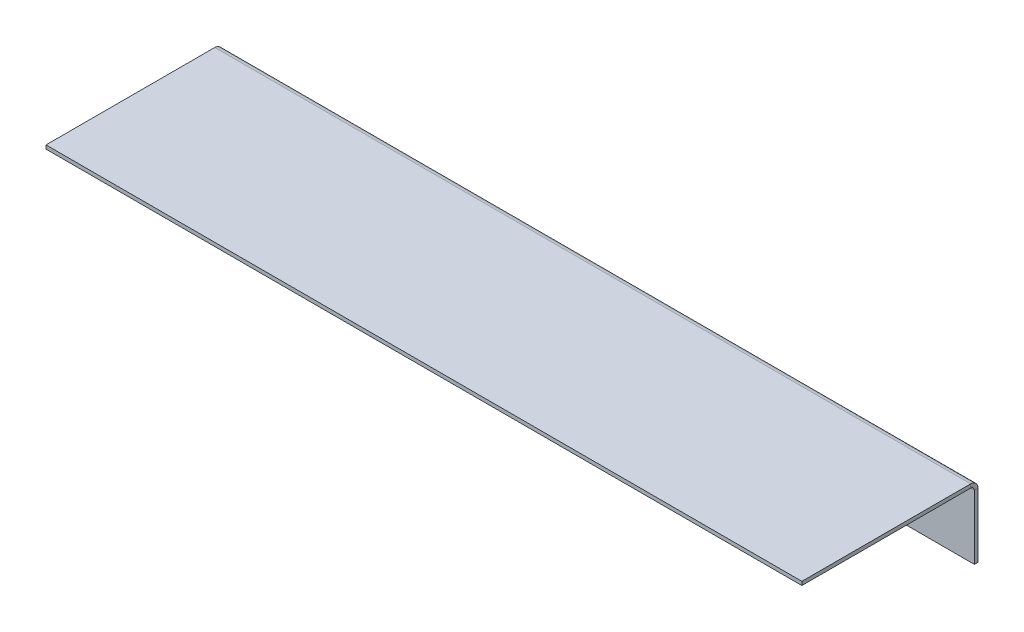
ISO-10303-21;
HEADER;
FILE_DESCRIPTION(('STEP AP214'),'2;1');
FILE_NAME('part.step','',(''),(''),'','','');
FILE_SCHEMA(('AUTOMOTIVE_DESIGN { 1 0 10303 214 1 1 1 1 }'));
ENDSEC;
DATA;
#1=APPLICATION_CONTEXT('core data for automotive mechanical design processes');
#2=APPLICATION_PROTOCOL_DEFINITION('international standard','automotive_design',2000,#1);
#3=PRODUCT_CONTEXT('',#1,'mechanical');
#4=PRODUCT('Part','Part','',(#3));
#5=PRODUCT_RELATED_PRODUCT_CATEGORY('part','',(#4));
#6=PRODUCT_DEFINITION_FORMATION('','',#4);
#7=PRODUCT_DEFINITION_CONTEXT('part definition',#1,'design');
#8=PRODUCT_DEFINITION('design','',#6,#7);
#9=PRODUCT_DEFINITION_SHAPE('','',#8);
#10=(LENGTH_UNIT() NAMED_UNIT(*) SI_UNIT(.MILLI.,.METRE.));
#11=(NAMED_UNIT(*) PLANE_ANGLE_UNIT() SI_UNIT($,.RADIAN.));
#12=(NAMED_UNIT(*) SI_UNIT($,.STERADIAN.) SOLID_ANGLE_UNIT());
#13=UNCERTAINTY_MEASURE_WITH_UNIT(LENGTH_MEASURE(1.E-05),#10,'distance_accuracy_value','');
#14=(GEOMETRIC_REPRESENTATION_CONTEXT(3) GLOBAL_UNCERTAINTY_ASSIGNED_CONTEXT((#13)) GLOBAL_UNIT_ASSIGNED_CONTEXT((#10,
#11,#12)) REPRESENTATION_CONTEXT('',''));
#15=CARTESIAN_POINT('',(0.,0.,0.));
#16=DIRECTION('',(0.,0.,1.));
#17=DIRECTION('',(1.,0.,0.));
#18=AXIS2_PLACEMENT_3D('',#15,#16,#17);
#19=CARTESIAN_POINT('',(0.,3.175,-146.05));
#20=DIRECTION('',(-1.,0.,0.));
#21=DIRECTION('',(0.,0.,1.));
#22=AXIS2_PLACEMENT_3D('',#19,#20,#21);
#23=PLANE('',#22);
#24=DIRECTION('',(0.,0.,1.));
#25=VECTOR('',#24,1.);
#26=CARTESIAN_POINT('',(0.,61.9125,0.));
#27=LINE('',#26,#25);
#28=CARTESIAN_POINT('',(0.,61.9125,-152.4));
#29=VERTEX_POINT('',#28);
#30=CARTESIAN_POINT('',(0.,61.9125,-149.225));
#31=VERTEX_POINT('',#30);
#32=EDGE_CURVE('E51',#29,#31,#27,.T.);
#33=ORIENTED_EDGE('',*,*,#32,.T.);
#34=DIRECTION('',(0.,1.,0.));
#35=VECTOR('',#34,1.);
#36=CARTESIAN_POINT('',(0.,0.,-149.225));
#37=LINE('',#36,#35);
#38=CARTESIAN_POINT('',(0.,117.475,-149.225));
#39=VERTEX_POINT('',#38);
#40=EDGE_CURVE('E156',#31,#39,#37,.T.);
#41=ORIENTED_EDGE('',*,*,#40,.T.);
#42=DIRECTION('',(0.,0.,-1.));
#43=VECTOR('',#42,1.);
#44=CARTESIAN_POINT('',(0.,117.475,-149.225));
#45=LINE('',#44,#43);
#46=CARTESIAN_POINT('',(0.,117.475,-152.4));
#47=VERTEX_POINT('',#46);
#48=EDGE_CURVE('E171',#39,#47,#45,.T.);
#49=ORIENTED_EDGE('',*,*,#48,.T.);
#50=DIRECTION('',(0.,1.,0.));
#51=VECTOR('',#50,1.);
#52=CARTESIAN_POINT('',(0.,0.,-152.4));
#53=LINE('',#52,#51);
#54=EDGE_CURVE('E158',#29,#47,#53,.T.);
#55=ORIENTED_EDGE('',*,*,#54,.F.);
#56=EDGE_LOOP('',(#33,#41,#49,#55));
#57=FACE_BOUND('',#56,.T.);
#58=ADVANCED_FACE('F37',(#57),#23,.T.);
#59=CARTESIAN_POINT('',(654.05,117.475,-152.4));
#60=DIRECTION('',(1.,0.,0.));
#61=DIRECTION('',(0.,0.,-1.));
#62=AXIS2_PLACEMENT_3D('',#59,#60,#61);
#63=PLANE('',#62);
#64=DIRECTION('',(0.,0.,1.));
#65=VECTOR('',#64,1.);
#66=CARTESIAN_POINT('',(654.05,117.475,-152.4));
#67=LINE('',#66,#65);
#68=CARTESIAN_POINT('',(654.05,117.475,-152.4));
#69=VERTEX_POINT('',#68);
#70=CARTESIAN_POINT('',(654.05,117.475,-149.225));
#71=VERTEX_POINT('',#70);
#72=EDGE_CURVE('E11',#69,#71,#67,.T.);
#73=ORIENTED_EDGE('',*,*,#72,.F.);
#74=CARTESIAN_POINT('',(654.05,117.475,-146.05));
#75=DIRECTION('',(-1.,0.,0.));
#76=DIRECTION('',(0.,0.,1.));
#77=AXIS2_PLACEMENT_3D('',#74,#75,#76);
#78=CIRCLE('',#77,6.35);
#79=CARTESIAN_POINT('',(654.05,123.825,-146.05));
#80=VERTEX_POINT('',#79);
#81=EDGE_CURVE('E143',#69,#80,#78,.F.);
#82=ORIENTED_EDGE('',*,*,#81,.T.);
#83=DIRECTION('',(0.,1.,0.));
#84=VECTOR('',#83,1.);
#85=CARTESIAN_POINT('',(654.05,120.65,-146.05));
#86=LINE('',#85,#84);
#87=CARTESIAN_POINT('',(654.05,120.65,-146.05));
#88=VERTEX_POINT('',#87);
#89=EDGE_CURVE('E44',#88,#80,#86,.T.);
#90=ORIENTED_EDGE('',*,*,#89,.F.);
#91=CARTESIAN_POINT('',(654.05,117.475,-146.05));
#92=DIRECTION('',(1.,0.,0.));
#93=DIRECTION('',(0.,0.,-1.));
#94=AXIS2_PLACEMENT_3D('',#91,#92,#93);
#95=CIRCLE('',#94,3.175);
#96=EDGE_CURVE('E117',#71,#88,#95,.T.);
#97=ORIENTED_EDGE('',*,*,#96,.F.);
#98=EDGE_LOOP('',(#73,#82,#90,#97));
#99=FACE_BOUND('',#98,.T.);
#100=ADVANCED_FACE('F133',(#99),#63,.T.);
#101=CARTESIAN_POINT('',(654.05,120.65,-146.05));
#102=DIRECTION('',(1.,0.,0.));
#103=DIRECTION('',(0.,0.,-1.));
#104=AXIS2_PLACEMENT_3D('',#101,#102,#103);
#105=PLANE('',#104);
#106=DIRECTION('',(0.,0.,1.));
#107=VECTOR('',#106,1.);
#108=CARTESIAN_POINT('',(654.05,61.9125,0.));
#109=LINE('',#108,#107);
#110=CARTESIAN_POINT('',(654.05,61.9125,-152.4));
#111=VERTEX_POINT('',#110);
#112=CARTESIAN_POINT('',(654.05,61.9125,-149.225));
#113=VERTEX_POINT('',#112);
#114=EDGE_CURVE('E196',#111,#113,#109,.T.);
#115=ORIENTED_EDGE('',*,*,#114,.F.);
#116=DIRECTION('',(0.,1.,0.));
#117=VECTOR('',#116,1.);
#118=CARTESIAN_POINT('',(654.05,0.,-152.4));
#119=LINE('',#118,#117);
#120=EDGE_CURVE('E116',#111,#69,#119,.T.);
#121=ORIENTED_EDGE('',*,*,#120,.T.);
#122=ORIENTED_EDGE('',*,*,#72,.T.);
#123=DIRECTION('',(0.,1.,0.));
#124=VECTOR('',#123,1.);
#125=CARTESIAN_POINT('',(654.05,0.,-149.225));
#126=LINE('',#125,#124);
#127=EDGE_CURVE('E106',#113,#71,#126,.T.);
#128=ORIENTED_EDGE('',*,*,#127,.F.);
#129=EDGE_LOOP('',(#115,#121,#122,#128));
#130=FACE_BOUND('',#129,.T.);
#131=ADVANCED_FACE('F120',(#130),#105,.T.);
#132=CARTESIAN_POINT('',(0.,123.825,-146.05));
#133=DIRECTION('',(-1.,0.,0.));
#134=DIRECTION('',(0.,0.,1.));
#135=AXIS2_PLACEMENT_3D('',#132,#133,#134);
#136=PLANE('',#135);
#137=DIRECTION('',(0.,-1.,0.));
#138=VECTOR('',#137,1.);
#139=CARTESIAN_POINT('',(0.,123.825,-146.05));
#140=LINE('',#139,#138);
#141=CARTESIAN_POINT('',(0.,123.825,-146.05));
#142=VERTEX_POINT('',#141);
#143=CARTESIAN_POINT('',(0.,120.65,-146.05));
#144=VERTEX_POINT('',#143);
#145=EDGE_CURVE('E87',#142,#144,#140,.T.);
#146=ORIENTED_EDGE('',*,*,#145,.F.);
#147=CARTESIAN_POINT('',(0.,117.475,-146.05));
#148=DIRECTION('',(-1.,0.,0.));
#149=DIRECTION('',(0.,0.,1.));
#150=AXIS2_PLACEMENT_3D('',#147,#148,#149);
#151=CIRCLE('',#150,6.35);
#152=EDGE_CURVE('E160',#47,#142,#151,.F.);
#153=ORIENTED_EDGE('',*,*,#152,.F.);
#154=ORIENTED_EDGE('',*,*,#48,.F.);
#155=CARTESIAN_POINT('',(0.,117.475,-146.05));
#156=DIRECTION('',(1.,0.,0.));
#157=DIRECTION('',(0.,0.,-1.));
#158=AXIS2_PLACEMENT_3D('',#155,#156,#157);
#159=CIRCLE('',#158,3.175);
#160=EDGE_CURVE('E129',#39,#144,#159,.T.);
#161=ORIENTED_EDGE('',*,*,#160,.T.);
#162=EDGE_LOOP('',(#146,#153,#154,#161));
#163=FACE_BOUND('',#162,.T.);
#164=ADVANCED_FACE('F182',(#163),#136,.T.);
#165=CARTESIAN_POINT('',(0.,117.475,-149.225));
#166=DIRECTION('',(-1.,0.,0.));
#167=DIRECTION('',(0.,0.,1.));
#168=AXIS2_PLACEMENT_3D('',#165,#166,#167);
#169=PLANE('',#168);
#170=DIRECTION('',(0.,0.,1.));
#171=VECTOR('',#170,1.);
#172=CARTESIAN_POINT('',(0.,123.825,-152.4));
#173=LINE('',#172,#171);
#174=CARTESIAN_POINT('',(0.,123.825,0.));
#175=VERTEX_POINT('',#174);
#176=EDGE_CURVE('E146',#142,#175,#173,.T.);
#177=ORIENTED_EDGE('',*,*,#176,.F.);
#178=ORIENTED_EDGE('',*,*,#145,.T.);
#179=DIRECTION('',(0.,0.,-1.));
#180=VECTOR('',#179,1.);
#181=CARTESIAN_POINT('',(0.,120.65,-152.4));
#182=LINE('',#181,#180);
#183=CARTESIAN_POINT('',(0.,120.65,0.));
#184=VERTEX_POINT('',#183);
#185=EDGE_CURVE('E152',#144,#184,#182,.F.);
#186=ORIENTED_EDGE('',*,*,#185,.T.);
#187=DIRECTION('',(0.,1.,0.));
#188=VECTOR('',#187,1.);
#189=CARTESIAN_POINT('',(0.,120.65,0.));
#190=LINE('',#189,#188);
#191=EDGE_CURVE('E149',#184,#175,#190,.T.);
#192=ORIENTED_EDGE('',*,*,#191,.T.);
#193=EDGE_LOOP('',(#177,#178,#186,#192));
#194=FACE_BOUND('',#193,.T.);
#195=ADVANCED_FACE('F176',(#194),#169,.T.);
#196=CARTESIAN_POINT('',(654.05,123.825,-152.4));
#197=DIRECTION('',(0.,-1.,0.));
#198=DIRECTION('',(0.,0.,-1.));
#199=AXIS2_PLACEMENT_3D('',#196,#197,#198);
#200=PLANE('',#199);
#201=ORIENTED_EDGE('',*,*,#176,.T.);
#202=DIRECTION('',(-1.,0.,0.));
#203=VECTOR('',#202,1.);
#204=CARTESIAN_POINT('',(654.05,123.825,0.));
#205=LINE('',#204,#203);
#206=CARTESIAN_POINT('',(654.05,123.825,0.));
#207=VERTEX_POINT('',#206);
#208=EDGE_CURVE('E169',#207,#175,#205,.T.);
#209=ORIENTED_EDGE('',*,*,#208,.F.);
#210=DIRECTION('',(0.,0.,1.));
#211=VECTOR('',#210,1.);
#212=CARTESIAN_POINT('',(654.05,123.825,-152.4));
#213=LINE('',#212,#211);
#214=EDGE_CURVE('E93',#80,#207,#213,.T.);
#215=ORIENTED_EDGE('',*,*,#214,.F.);
#216=DIRECTION('',(-1.,0.,0.));
#217=VECTOR('',#216,1.);
#218=CARTESIAN_POINT('',(654.05,123.825,-146.05));
#219=LINE('',#218,#217);
#220=EDGE_CURVE('E145',#80,#142,#219,.T.);
#221=ORIENTED_EDGE('',*,*,#220,.T.);
#222=EDGE_LOOP('',(#201,#209,#215,#221));
#223=FACE_BOUND('',#222,.T.);
#224=ADVANCED_FACE('F226',(#223),#200,.F.);
#225=CARTESIAN_POINT('',(654.05,120.65,0.));
#226=DIRECTION('',(0.,0.,1.));
#227=DIRECTION('',(0.,-1.,0.));
#228=AXIS2_PLACEMENT_3D('',#225,#226,#227);
#229=PLANE('',#228);
#230=ORIENTED_EDGE('',*,*,#191,.F.);
#231=DIRECTION('',(-1.,0.,0.));
#232=VECTOR('',#231,1.);
#233=CARTESIAN_POINT('',(654.05,120.65,0.));
#234=LINE('',#233,#232);
#235=CARTESIAN_POINT('',(654.05,120.65,0.));
#236=VERTEX_POINT('',#235);
#237=EDGE_CURVE('E167',#236,#184,#234,.T.);
#238=ORIENTED_EDGE('',*,*,#237,.F.);
#239=DIRECTION('',(0.,1.,0.));
#240=VECTOR('',#239,1.);
#241=CARTESIAN_POINT('',(654.05,120.65,0.));
#242=LINE('',#241,#240);
#243=EDGE_CURVE('E138',#236,#207,#242,.T.);
#244=ORIENTED_EDGE('',*,*,#243,.T.);
#245=ORIENTED_EDGE('',*,*,#208,.T.);
#246=EDGE_LOOP('',(#230,#238,#244,#245));
#247=FACE_BOUND('',#246,.T.);
#248=ADVANCED_FACE('F202',(#247),#229,.T.);
#249=CARTESIAN_POINT('',(654.05,120.65,-152.4));
#250=DIRECTION('',(0.,-1.,0.));
#251=DIRECTION('',(0.,0.,-1.));
#252=AXIS2_PLACEMENT_3D('',#249,#250,#251);
#253=PLANE('',#252);
#254=ORIENTED_EDGE('',*,*,#185,.F.);
#255=DIRECTION('',(-1.,0.,0.));
#256=VECTOR('',#255,1.);
#257=CARTESIAN_POINT('',(654.05,120.65,-146.05));
#258=LINE('',#257,#256);
#259=EDGE_CURVE('E130',#88,#144,#258,.T.);
#260=ORIENTED_EDGE('',*,*,#259,.F.);
#261=DIRECTION('',(0.,0.,-1.));
#262=VECTOR('',#261,1.);
#263=CARTESIAN_POINT('',(654.05,120.65,-152.4));
#264=LINE('',#263,#262);
#265=EDGE_CURVE('E135',#88,#236,#264,.F.);
#266=ORIENTED_EDGE('',*,*,#265,.T.);
#267=ORIENTED_EDGE('',*,*,#237,.T.);
#268=EDGE_LOOP('',(#254,#260,#266,#267));
#269=FACE_BOUND('',#268,.T.);
#270=ADVANCED_FACE('F179',(#269),#253,.T.);
#271=CARTESIAN_POINT('',(654.05,117.475,-146.05));
#272=DIRECTION('',(-1.,0.,0.));
#273=DIRECTION('',(0.,0.,1.));
#274=AXIS2_PLACEMENT_3D('',#271,#272,#273);
#275=CYLINDRICAL_SURFACE('',#274,3.175);
#276=ORIENTED_EDGE('',*,*,#160,.F.);
#277=DIRECTION('',(-1.,0.,0.));
#278=VECTOR('',#277,1.);
#279=CARTESIAN_POINT('',(654.05,117.475,-149.225));
#280=LINE('',#279,#278);
#281=EDGE_CURVE('E110',#71,#39,#280,.T.);
#282=ORIENTED_EDGE('',*,*,#281,.F.);
#283=ORIENTED_EDGE('',*,*,#96,.T.);
#284=ORIENTED_EDGE('',*,*,#259,.T.);
#285=EDGE_LOOP('',(#276,#282,#283,#284));
#286=FACE_BOUND('',#285,.T.);
#287=ADVANCED_FACE('F127',(#286),#275,.F.);
#288=CARTESIAN_POINT('',(654.05,0.,-149.225));
#289=DIRECTION('',(0.,0.,1.));
#290=DIRECTION('',(1.,0.,0.));
#291=AXIS2_PLACEMENT_3D('',#288,#289,#290);
#292=PLANE('',#291);
#293=DIRECTION('',(-1.,0.,0.));
#294=VECTOR('',#293,1.);
#295=CARTESIAN_POINT('',(654.05,61.9125,-149.225));
#296=LINE('',#295,#294);
#297=EDGE_CURVE('E113',#113,#31,#296,.T.);
#298=ORIENTED_EDGE('',*,*,#297,.F.);
#299=ORIENTED_EDGE('',*,*,#127,.T.);
#300=ORIENTED_EDGE('',*,*,#281,.T.);
#301=ORIENTED_EDGE('',*,*,#40,.F.);
#302=EDGE_LOOP('',(#298,#299,#300,#301));
#303=FACE_BOUND('',#302,.T.);
#304=ADVANCED_FACE('F107',(#303),#292,.T.);
#305=CARTESIAN_POINT('',(654.05,0.,-152.4));
#306=DIRECTION('',(0.,0.,1.));
#307=DIRECTION('',(1.,0.,0.));
#308=AXIS2_PLACEMENT_3D('',#305,#306,#307);
#309=PLANE('',#308);
#310=ORIENTED_EDGE('',*,*,#120,.F.);
#311=DIRECTION('',(1.,0.,0.));
#312=VECTOR('',#311,1.);
#313=CARTESIAN_POINT('',(0.,61.9125,-152.4));
#314=LINE('',#313,#312);
#315=EDGE_CURVE('E192',#29,#111,#314,.T.);
#316=ORIENTED_EDGE('',*,*,#315,.F.);
#317=ORIENTED_EDGE('',*,*,#54,.T.);
#318=DIRECTION('',(-1.,0.,0.));
#319=VECTOR('',#318,1.);
#320=CARTESIAN_POINT('',(654.05,117.475,-152.4));
#321=LINE('',#320,#319);
#322=EDGE_CURVE('E131',#69,#47,#321,.T.);
#323=ORIENTED_EDGE('',*,*,#322,.F.);
#324=EDGE_LOOP('',(#310,#316,#317,#323));
#325=FACE_BOUND('',#324,.T.);
#326=ADVANCED_FACE('F190',(#325),#309,.F.);
#327=CARTESIAN_POINT('',(654.05,117.475,-146.05));
#328=DIRECTION('',(-1.,0.,0.));
#329=DIRECTION('',(0.,0.,1.));
#330=AXIS2_PLACEMENT_3D('',#327,#328,#329);
#331=CYLINDRICAL_SURFACE('',#330,6.35);
#332=ORIENTED_EDGE('',*,*,#152,.T.);
#333=ORIENTED_EDGE('',*,*,#220,.F.);
#334=ORIENTED_EDGE('',*,*,#81,.F.);
#335=ORIENTED_EDGE('',*,*,#322,.T.);
#336=EDGE_LOOP('',(#332,#333,#334,#335));
#337=FACE_BOUND('',#336,.T.);
#338=ADVANCED_FACE('F187',(#337),#331,.T.);
#339=CARTESIAN_POINT('',(654.05,117.475,-146.05));
#340=DIRECTION('',(1.,0.,0.));
#341=DIRECTION('',(0.,0.,-1.));
#342=AXIS2_PLACEMENT_3D('',#339,#340,#341);
#343=PLANE('',#342);
#344=ORIENTED_EDGE('',*,*,#214,.T.);
#345=ORIENTED_EDGE('',*,*,#243,.F.);
#346=ORIENTED_EDGE('',*,*,#265,.F.);
#347=ORIENTED_EDGE('',*,*,#89,.T.);
#348=EDGE_LOOP('',(#344,#345,#346,#347));
#349=FACE_BOUND('',#348,.T.);
#350=ADVANCED_FACE('F203',(#349),#343,.T.);
#351=CARTESIAN_POINT('',(0.,61.9125,0.));
#352=DIRECTION('',(0.,1.,0.));
#353=DIRECTION('',(0.,0.,1.));
#354=AXIS2_PLACEMENT_3D('',#351,#352,#353);
#355=PLANE('',#354);
#356=ORIENTED_EDGE('',*,*,#297,.T.);
#357=ORIENTED_EDGE('',*,*,#32,.F.);
#358=ORIENTED_EDGE('',*,*,#315,.T.);
#359=ORIENTED_EDGE('',*,*,#114,.T.);
#360=EDGE_LOOP('',(#356,#357,#358,#359));
#361=FACE_BOUND('',#360,.T.);
#362=ADVANCED_FACE('F205',(#361),#355,.F.);
#363=CLOSED_SHELL('',(#58,#100,#131,#164,#195,#224,#248,#270,#287,#304,#326,#338,#350,#362));
#364=MANIFOLD_SOLID_BREP('B2',#363);
#365=ADVANCED_BREP_SHAPE_REPRESENTATION('',(#18,#364),#14);
#366=SHAPE_DEFINITION_REPRESENTATION(#9,#365);
ENDSEC;
END-ISO-10303-21;
